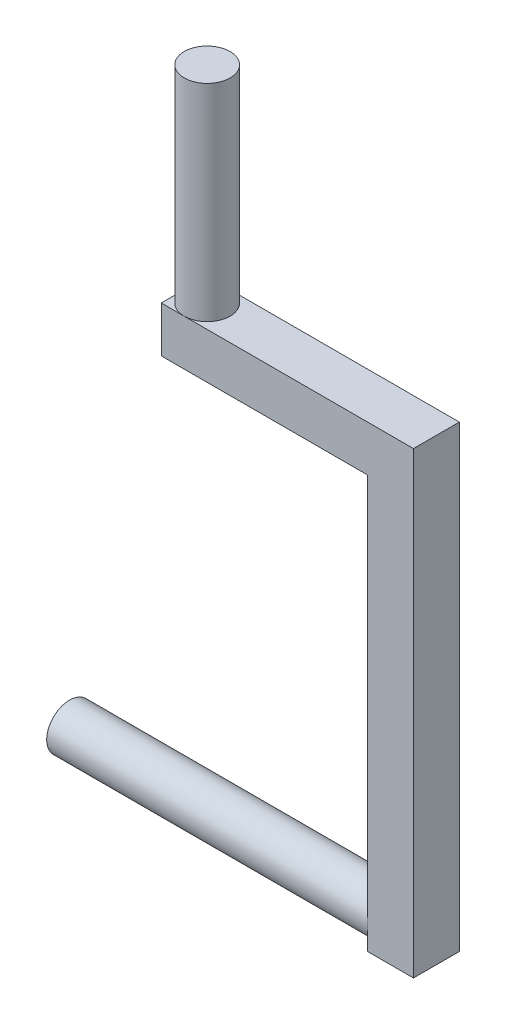
ISO-10303-21;
HEADER;
FILE_DESCRIPTION(('STEP AP214'),'2;1');
FILE_NAME('part.step','',(''),(''),'','','');
FILE_SCHEMA(('AUTOMOTIVE_DESIGN { 1 0 10303 214 1 1 1 1 }'));
ENDSEC;
DATA;
#1=APPLICATION_CONTEXT('core data for automotive mechanical design processes');
#2=APPLICATION_PROTOCOL_DEFINITION('international standard','automotive_design',2000,#1);
#3=PRODUCT_CONTEXT('',#1,'mechanical');
#4=PRODUCT('Part','Part','',(#3));
#5=PRODUCT_RELATED_PRODUCT_CATEGORY('part','',(#4));
#6=PRODUCT_DEFINITION_FORMATION('','',#4);
#7=PRODUCT_DEFINITION_CONTEXT('part definition',#1,'design');
#8=PRODUCT_DEFINITION('design','',#6,#7);
#9=PRODUCT_DEFINITION_SHAPE('','',#8);
#10=(LENGTH_UNIT() NAMED_UNIT(*) SI_UNIT(.MILLI.,.METRE.));
#11=(NAMED_UNIT(*) PLANE_ANGLE_UNIT() SI_UNIT($,.RADIAN.));
#12=(NAMED_UNIT(*) SI_UNIT($,.STERADIAN.) SOLID_ANGLE_UNIT());
#13=UNCERTAINTY_MEASURE_WITH_UNIT(LENGTH_MEASURE(1.E-05),#10,'distance_accuracy_value','');
#14=(GEOMETRIC_REPRESENTATION_CONTEXT(3) GLOBAL_UNCERTAINTY_ASSIGNED_CONTEXT((#13)) GLOBAL_UNIT_ASSIGNED_CONTEXT((#10,
#11,#12)) REPRESENTATION_CONTEXT('',''));
#15=CARTESIAN_POINT('',(0.,0.,0.));
#16=DIRECTION('',(0.,0.,1.));
#17=DIRECTION('',(1.,0.,0.));
#18=AXIS2_PLACEMENT_3D('',#15,#16,#17);
#19=CARTESIAN_POINT('',(50.8,-184.15,-6.35));
#20=DIRECTION('',(1.,0.,0.));
#21=DIRECTION('',(0.,0.,-1.));
#22=AXIS2_PLACEMENT_3D('',#19,#20,#21);
#23=PLANE('',#22);
#24=CARTESIAN_POINT('',(50.8,-177.8,0.));
#25=DIRECTION('',(-1.,0.,0.));
#26=DIRECTION('',(0.,0.,1.));
#27=AXIS2_PLACEMENT_3D('',#24,#25,#26);
#28=CIRCLE('',#27,6.35);
#29=CARTESIAN_POINT('',(50.8,-177.8,-6.35));
#30=VERTEX_POINT('',#29);
#31=CARTESIAN_POINT('',(50.8,-184.15,0.));
#32=VERTEX_POINT('',#31);
#33=EDGE_CURVE('E135',#30,#32,#28,.T.);
#34=ORIENTED_EDGE('',*,*,#33,.F.);
#35=DIRECTION('',(0.,1.,0.));
#36=VECTOR('',#35,1.);
#37=CARTESIAN_POINT('',(50.8,-184.15,-6.35));
#38=LINE('',#37,#36);
#39=CARTESIAN_POINT('',(50.8,-184.15,-6.35));
#40=VERTEX_POINT('',#39);
#41=EDGE_CURVE('E116',#40,#30,#38,.T.);
#42=ORIENTED_EDGE('',*,*,#41,.F.);
#43=DIRECTION('',(0.,0.,-1.));
#44=VECTOR('',#43,1.);
#45=CARTESIAN_POINT('',(50.8,-184.15,-6.35));
#46=LINE('',#45,#44);
#47=EDGE_CURVE('E136',#32,#40,#46,.T.);
#48=ORIENTED_EDGE('',*,*,#47,.F.);
#49=EDGE_LOOP('',(#34,#42,#48));
#50=FACE_BOUND('',#49,.T.);
#51=ADVANCED_FACE('F39',(#50),#23,.F.);
#52=CARTESIAN_POINT('',(50.8,-177.8,6.35));
#53=VERTEX_POINT('',#52);
#54=EDGE_CURVE('E65',#32,#53,#28,.T.);
#55=ORIENTED_EDGE('',*,*,#54,.F.);
#56=CARTESIAN_POINT('',(50.8,-184.15,6.35));
#57=VERTEX_POINT('',#56);
#58=EDGE_CURVE('E149',#57,#32,#46,.T.);
#59=ORIENTED_EDGE('',*,*,#58,.F.);
#60=DIRECTION('',(0.,1.,0.));
#61=VECTOR('',#60,1.);
#62=CARTESIAN_POINT('',(50.8,-184.15,6.35));
#63=LINE('',#62,#61);
#64=EDGE_CURVE('E133',#57,#53,#63,.T.);
#65=ORIENTED_EDGE('',*,*,#64,.T.);
#66=EDGE_LOOP('',(#55,#59,#65));
#67=FACE_BOUND('',#66,.T.);
#68=ADVANCED_FACE('F235',(#67),#23,.F.);
#69=CARTESIAN_POINT('',(0.,-69.85,0.));
#70=DIRECTION('',(0.,1.,0.));
#71=DIRECTION('',(0.,0.,1.));
#72=AXIS2_PLACEMENT_3D('',#69,#70,#71);
#73=PLANE('',#72);
#74=DIRECTION('',(0.,0.,-1.));
#75=VECTOR('',#74,1.);
#76=CARTESIAN_POINT('',(50.8,-69.85,-6.35));
#77=LINE('',#76,#75);
#78=CARTESIAN_POINT('',(50.8,-69.85,6.35));
#79=VERTEX_POINT('',#78);
#80=CARTESIAN_POINT('',(50.8,-69.85,-6.35));
#81=VERTEX_POINT('',#80);
#82=EDGE_CURVE('E131',#79,#81,#77,.T.);
#83=ORIENTED_EDGE('',*,*,#82,.F.);
#84=DIRECTION('',(-1.,0.,0.));
#85=VECTOR('',#84,1.);
#86=CARTESIAN_POINT('',(63.5,-69.85,6.35));
#87=LINE('',#86,#85);
#88=CARTESIAN_POINT('',(-6.35,-69.85,6.35));
#89=VERTEX_POINT('',#88);
#90=EDGE_CURVE('E174',#79,#89,#87,.T.);
#91=ORIENTED_EDGE('',*,*,#90,.T.);
#92=DIRECTION('',(0.,0.,1.));
#93=VECTOR('',#92,1.);
#94=CARTESIAN_POINT('',(-6.35,-69.85,-6.35));
#95=LINE('',#94,#93);
#96=CARTESIAN_POINT('',(-6.35,-69.85,-6.35));
#97=VERTEX_POINT('',#96);
#98=EDGE_CURVE('E169',#97,#89,#95,.T.);
#99=ORIENTED_EDGE('',*,*,#98,.F.);
#100=DIRECTION('',(-1.,0.,0.));
#101=VECTOR('',#100,1.);
#102=CARTESIAN_POINT('',(63.5,-69.85,-6.35));
#103=LINE('',#102,#101);
#104=EDGE_CURVE('E166',#81,#97,#103,.T.);
#105=ORIENTED_EDGE('',*,*,#104,.F.);
#106=EDGE_LOOP('',(#83,#91,#99,#105));
#107=FACE_BOUND('',#106,.T.);
#108=ADVANCED_FACE('F229',(#107),#73,.F.);
#109=CARTESIAN_POINT('',(0.,-57.15,0.));
#110=DIRECTION('',(0.,1.,0.));
#111=DIRECTION('',(0.,0.,1.));
#112=AXIS2_PLACEMENT_3D('',#109,#110,#111);
#113=CYLINDRICAL_SURFACE('',#112,6.35);
#114=CARTESIAN_POINT('',(0.,-57.15,0.));
#115=DIRECTION('',(0.,1.,0.));
#116=DIRECTION('',(0.,0.,1.));
#117=AXIS2_PLACEMENT_3D('',#114,#115,#116);
#118=CIRCLE('',#117,6.35);
#119=CARTESIAN_POINT('',(0.,-57.15,6.35));
#120=VERTEX_POINT('',#119);
#121=CARTESIAN_POINT('',(0.,-57.15,-6.35));
#122=VERTEX_POINT('',#121);
#123=EDGE_CURVE('E11',#120,#122,#118,.T.);
#124=ORIENTED_EDGE('',*,*,#123,.T.);
#125=CARTESIAN_POINT('',(-6.35,-57.15,0.));
#126=VERTEX_POINT('',#125);
#127=EDGE_CURVE('E49',#122,#126,#118,.T.);
#128=ORIENTED_EDGE('',*,*,#127,.T.);
#129=EDGE_CURVE('E50',#126,#120,#118,.T.);
#130=ORIENTED_EDGE('',*,*,#129,.T.);
#131=EDGE_LOOP('',(#124,#128,#130));
#132=FACE_BOUND('',#131,.T.);
#133=CARTESIAN_POINT('',(0.,0.,0.));
#134=DIRECTION('',(0.,1.,0.));
#135=DIRECTION('',(0.,0.,1.));
#136=AXIS2_PLACEMENT_3D('',#133,#134,#135);
#137=CIRCLE('',#136,6.35);
#138=CARTESIAN_POINT('',(0.,0.,6.35));
#139=VERTEX_POINT('',#138);
#140=EDGE_CURVE('E43',#139,#139,#137,.T.);
#141=ORIENTED_EDGE('',*,*,#140,.F.);
#142=EDGE_LOOP('',(#141));
#143=FACE_BOUND('',#142,.T.);
#144=ADVANCED_FACE('F41',(#132,#143),#113,.T.);
#145=CARTESIAN_POINT('',(0.,0.,0.));
#146=DIRECTION('',(0.,1.,0.));
#147=DIRECTION('',(0.,0.,1.));
#148=AXIS2_PLACEMENT_3D('',#145,#146,#147);
#149=PLANE('',#148);
#150=ORIENTED_EDGE('',*,*,#140,.T.);
#151=EDGE_LOOP('',(#150));
#152=FACE_BOUND('',#151,.T.);
#153=ADVANCED_FACE('F227',(#152),#149,.T.);
#154=CARTESIAN_POINT('',(0.,-57.15,0.));
#155=DIRECTION('',(0.,1.,0.));
#156=DIRECTION('',(0.,0.,1.));
#157=AXIS2_PLACEMENT_3D('',#154,#155,#156);
#158=PLANE('',#157);
#159=ORIENTED_EDGE('',*,*,#123,.F.);
#160=DIRECTION('',(-1.,0.,0.));
#161=VECTOR('',#160,1.);
#162=CARTESIAN_POINT('',(63.5,-57.15,6.35));
#163=LINE('',#162,#161);
#164=CARTESIAN_POINT('',(63.5,-57.15,6.35));
#165=VERTEX_POINT('',#164);
#166=EDGE_CURVE('E188',#165,#120,#163,.T.);
#167=ORIENTED_EDGE('',*,*,#166,.F.);
#168=DIRECTION('',(0.,0.,1.));
#169=VECTOR('',#168,1.);
#170=CARTESIAN_POINT('',(63.5,-57.15,-6.35));
#171=LINE('',#170,#169);
#172=CARTESIAN_POINT('',(63.5,-57.15,-6.35));
#173=VERTEX_POINT('',#172);
#174=EDGE_CURVE('E170',#173,#165,#171,.T.);
#175=ORIENTED_EDGE('',*,*,#174,.F.);
#176=DIRECTION('',(-1.,0.,0.));
#177=VECTOR('',#176,1.);
#178=CARTESIAN_POINT('',(63.5,-57.15,-6.35));
#179=LINE('',#178,#177);
#180=EDGE_CURVE('E178',#173,#122,#179,.T.);
#181=ORIENTED_EDGE('',*,*,#180,.T.);
#182=EDGE_LOOP('',(#159,#167,#175,#181));
#183=FACE_BOUND('',#182,.T.);
#184=ADVANCED_FACE('F234',(#183),#158,.T.);
#185=ORIENTED_EDGE('',*,*,#127,.F.);
#186=CARTESIAN_POINT('',(-6.35,-57.15,-6.35));
#187=VERTEX_POINT('',#186);
#188=EDGE_CURVE('E126',#122,#187,#179,.T.);
#189=ORIENTED_EDGE('',*,*,#188,.T.);
#190=DIRECTION('',(0.,0.,1.));
#191=VECTOR('',#190,1.);
#192=CARTESIAN_POINT('',(-6.35,-57.15,-6.35));
#193=LINE('',#192,#191);
#194=EDGE_CURVE('E183',#187,#126,#193,.T.);
#195=ORIENTED_EDGE('',*,*,#194,.T.);
#196=EDGE_LOOP('',(#185,#189,#195));
#197=FACE_BOUND('',#196,.T.);
#198=ADVANCED_FACE('F216',(#197),#158,.T.);
#199=ORIENTED_EDGE('',*,*,#129,.F.);
#200=CARTESIAN_POINT('',(-6.35,-57.15,6.35));
#201=VERTEX_POINT('',#200);
#202=EDGE_CURVE('E182',#126,#201,#193,.T.);
#203=ORIENTED_EDGE('',*,*,#202,.T.);
#204=EDGE_CURVE('E187',#120,#201,#163,.T.);
#205=ORIENTED_EDGE('',*,*,#204,.F.);
#206=EDGE_LOOP('',(#199,#203,#205));
#207=FACE_BOUND('',#206,.T.);
#208=ADVANCED_FACE('F262',(#207),#158,.T.);
#209=CARTESIAN_POINT('',(63.5,-69.85,-6.35));
#210=DIRECTION('',(0.,0.,-1.));
#211=DIRECTION('',(-1.,0.,0.));
#212=AXIS2_PLACEMENT_3D('',#209,#210,#211);
#213=PLANE('',#212);
#214=ORIENTED_EDGE('',*,*,#180,.F.);
#215=DIRECTION('',(0.,1.,0.));
#216=VECTOR('',#215,1.);
#217=CARTESIAN_POINT('',(63.5,-69.85,-6.35));
#218=LINE('',#217,#216);
#219=CARTESIAN_POINT('',(63.5,-184.15,-6.35));
#220=VERTEX_POINT('',#219);
#221=EDGE_CURVE('E193',#220,#173,#218,.T.);
#222=ORIENTED_EDGE('',*,*,#221,.F.);
#223=DIRECTION('',(1.,0.,0.));
#224=VECTOR('',#223,1.);
#225=CARTESIAN_POINT('',(63.5,-184.15,-6.35));
#226=LINE('',#225,#224);
#227=EDGE_CURVE('E122',#40,#220,#226,.T.);
#228=ORIENTED_EDGE('',*,*,#227,.F.);
#229=ORIENTED_EDGE('',*,*,#41,.T.);
#230=EDGE_CURVE('E119',#30,#81,#38,.T.);
#231=ORIENTED_EDGE('',*,*,#230,.T.);
#232=ORIENTED_EDGE('',*,*,#104,.T.);
#233=DIRECTION('',(0.,1.,0.));
#234=VECTOR('',#233,1.);
#235=CARTESIAN_POINT('',(-6.35,-69.85,-6.35));
#236=LINE('',#235,#234);
#237=EDGE_CURVE('E177',#97,#187,#236,.T.);
#238=ORIENTED_EDGE('',*,*,#237,.T.);
#239=ORIENTED_EDGE('',*,*,#188,.F.);
#240=EDGE_LOOP('',(#214,#222,#228,#229,#231,#232,#238,#239));
#241=FACE_BOUND('',#240,.T.);
#242=ADVANCED_FACE('F118',(#241),#213,.T.);
#243=CARTESIAN_POINT('',(63.5,-69.85,-6.35));
#244=DIRECTION('',(-1.,0.,0.));
#245=DIRECTION('',(0.,0.,1.));
#246=AXIS2_PLACEMENT_3D('',#243,#244,#245);
#247=PLANE('',#246);
#248=ORIENTED_EDGE('',*,*,#174,.T.);
#249=DIRECTION('',(0.,1.,0.));
#250=VECTOR('',#249,1.);
#251=CARTESIAN_POINT('',(63.5,-69.85,6.35));
#252=LINE('',#251,#250);
#253=CARTESIAN_POINT('',(63.5,-184.15,6.35));
#254=VERTEX_POINT('',#253);
#255=EDGE_CURVE('E196',#254,#165,#252,.T.);
#256=ORIENTED_EDGE('',*,*,#255,.F.);
#257=DIRECTION('',(0.,0.,1.));
#258=VECTOR('',#257,1.);
#259=CARTESIAN_POINT('',(63.5,-184.15,-6.35));
#260=LINE('',#259,#258);
#261=EDGE_CURVE('E154',#220,#254,#260,.T.);
#262=ORIENTED_EDGE('',*,*,#261,.F.);
#263=ORIENTED_EDGE('',*,*,#221,.T.);
#264=EDGE_LOOP('',(#248,#256,#262,#263));
#265=FACE_BOUND('',#264,.T.);
#266=ADVANCED_FACE('F256',(#265),#247,.F.);
#267=CARTESIAN_POINT('',(63.5,-69.85,6.35));
#268=DIRECTION('',(0.,0.,-1.));
#269=DIRECTION('',(-1.,0.,0.));
#270=AXIS2_PLACEMENT_3D('',#267,#268,#269);
#271=PLANE('',#270);
#272=ORIENTED_EDGE('',*,*,#166,.T.);
#273=ORIENTED_EDGE('',*,*,#204,.T.);
#274=DIRECTION('',(0.,1.,0.));
#275=VECTOR('',#274,1.);
#276=CARTESIAN_POINT('',(-6.35,-69.85,6.35));
#277=LINE('',#276,#275);
#278=EDGE_CURVE('E200',#89,#201,#277,.T.);
#279=ORIENTED_EDGE('',*,*,#278,.F.);
#280=ORIENTED_EDGE('',*,*,#90,.F.);
#281=EDGE_CURVE('E161',#53,#79,#63,.T.);
#282=ORIENTED_EDGE('',*,*,#281,.F.);
#283=ORIENTED_EDGE('',*,*,#64,.F.);
#284=DIRECTION('',(-1.,0.,0.));
#285=VECTOR('',#284,1.);
#286=CARTESIAN_POINT('',(63.5,-184.15,6.35));
#287=LINE('',#286,#285);
#288=EDGE_CURVE('E158',#254,#57,#287,.T.);
#289=ORIENTED_EDGE('',*,*,#288,.F.);
#290=ORIENTED_EDGE('',*,*,#255,.T.);
#291=EDGE_LOOP('',(#272,#273,#279,#280,#282,#283,#289,#290));
#292=FACE_BOUND('',#291,.T.);
#293=ADVANCED_FACE('F251',(#292),#271,.F.);
#294=CARTESIAN_POINT('',(-6.35,-69.85,-6.35));
#295=DIRECTION('',(-1.,0.,0.));
#296=DIRECTION('',(0.,0.,1.));
#297=AXIS2_PLACEMENT_3D('',#294,#295,#296);
#298=PLANE('',#297);
#299=ORIENTED_EDGE('',*,*,#194,.F.);
#300=ORIENTED_EDGE('',*,*,#237,.F.);
#301=ORIENTED_EDGE('',*,*,#98,.T.);
#302=ORIENTED_EDGE('',*,*,#278,.T.);
#303=ORIENTED_EDGE('',*,*,#202,.F.);
#304=EDGE_LOOP('',(#299,#300,#301,#302,#303));
#305=FACE_BOUND('',#304,.T.);
#306=ADVANCED_FACE('F212',(#305),#298,.T.);
#307=EDGE_CURVE('E57',#53,#30,#28,.T.);
#308=ORIENTED_EDGE('',*,*,#307,.F.);
#309=ORIENTED_EDGE('',*,*,#281,.T.);
#310=ORIENTED_EDGE('',*,*,#82,.T.);
#311=ORIENTED_EDGE('',*,*,#230,.F.);
#312=EDGE_LOOP('',(#308,#309,#310,#311));
#313=FACE_BOUND('',#312,.T.);
#314=ADVANCED_FACE('F129',(#313),#23,.F.);
#315=CARTESIAN_POINT('',(0.,-184.15,0.));
#316=DIRECTION('',(0.,-1.,0.));
#317=DIRECTION('',(0.,0.,-1.));
#318=AXIS2_PLACEMENT_3D('',#315,#316,#317);
#319=PLANE('',#318);
#320=ORIENTED_EDGE('',*,*,#58,.T.);
#321=ORIENTED_EDGE('',*,*,#47,.T.);
#322=ORIENTED_EDGE('',*,*,#227,.T.);
#323=ORIENTED_EDGE('',*,*,#261,.T.);
#324=ORIENTED_EDGE('',*,*,#288,.T.);
#325=EDGE_LOOP('',(#320,#321,#322,#323,#324));
#326=FACE_BOUND('',#325,.T.);
#327=ADVANCED_FACE('F245',(#326),#319,.T.);
#328=CARTESIAN_POINT('',(-38.1,-177.8,0.));
#329=DIRECTION('',(1.,0.,0.));
#330=DIRECTION('',(0.,0.,-1.));
#331=AXIS2_PLACEMENT_3D('',#328,#329,#330);
#332=CYLINDRICAL_SURFACE('',#331,6.35);
#333=CARTESIAN_POINT('',(-38.1,-177.8,0.));
#334=DIRECTION('',(-1.,0.,0.));
#335=DIRECTION('',(0.,0.,1.));
#336=AXIS2_PLACEMENT_3D('',#333,#334,#335);
#337=CIRCLE('',#336,6.35);
#338=CARTESIAN_POINT('',(-38.1,-177.8,6.35));
#339=VERTEX_POINT('',#338);
#340=EDGE_CURVE('E143',#339,#339,#337,.T.);
#341=ORIENTED_EDGE('',*,*,#340,.F.);
#342=EDGE_LOOP('',(#341));
#343=FACE_BOUND('',#342,.T.);
#344=ORIENTED_EDGE('',*,*,#307,.T.);
#345=ORIENTED_EDGE('',*,*,#33,.T.);
#346=ORIENTED_EDGE('',*,*,#54,.T.);
#347=EDGE_LOOP('',(#344,#345,#346));
#348=FACE_BOUND('',#347,.T.);
#349=ADVANCED_FACE('F141',(#343,#348),#332,.T.);
#350=CARTESIAN_POINT('',(-38.1,-177.8,0.));
#351=DIRECTION('',(-1.,0.,0.));
#352=DIRECTION('',(0.,0.,1.));
#353=AXIS2_PLACEMENT_3D('',#350,#351,#352);
#354=PLANE('',#353);
#355=ORIENTED_EDGE('',*,*,#340,.T.);
#356=EDGE_LOOP('',(#355));
#357=FACE_BOUND('',#356,.T.);
#358=ADVANCED_FACE('F358',(#357),#354,.T.);
#359=CLOSED_SHELL('',(#51,#68,#108,#144,#153,#184,#198,#208,#242,#266,#293,#306,#314,#327,#349,#358));
#360=MANIFOLD_SOLID_BREP('B2',#359);
#361=ADVANCED_BREP_SHAPE_REPRESENTATION('',(#18,#360),#14);
#362=SHAPE_DEFINITION_REPRESENTATION(#9,#361);
ENDSEC;
END-ISO-10303-21;
